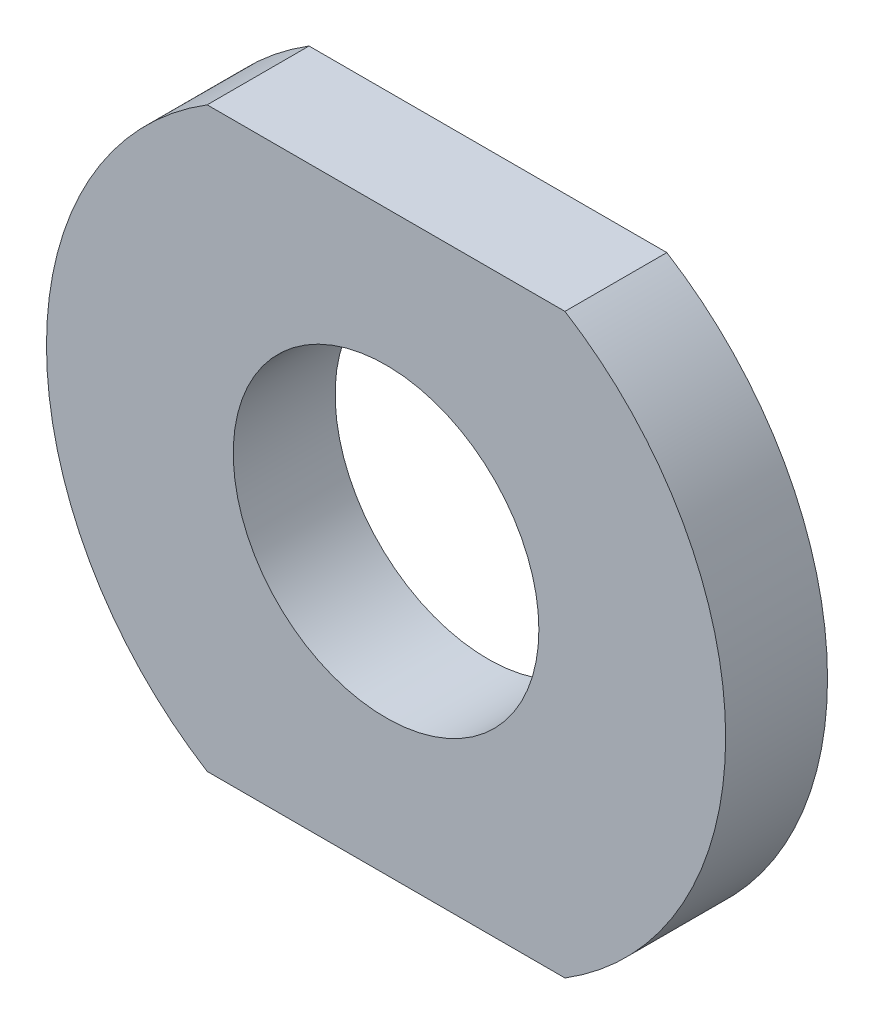
ISO-10303-21;
HEADER;
FILE_DESCRIPTION(('STEP AP214'),'2;1');
FILE_NAME('part.step','',(''),(''),'','','');
FILE_SCHEMA(('AUTOMOTIVE_DESIGN { 1 0 10303 214 1 1 1 1 }'));
ENDSEC;
DATA;
#1=APPLICATION_CONTEXT('core data for automotive mechanical design processes');
#2=APPLICATION_PROTOCOL_DEFINITION('international standard','automotive_design',2000,#1);
#3=PRODUCT_CONTEXT('',#1,'mechanical');
#4=PRODUCT('Part','Part','',(#3));
#5=PRODUCT_RELATED_PRODUCT_CATEGORY('part','',(#4));
#6=PRODUCT_DEFINITION_FORMATION('','',#4);
#7=PRODUCT_DEFINITION_CONTEXT('part definition',#1,'design');
#8=PRODUCT_DEFINITION('design','',#6,#7);
#9=PRODUCT_DEFINITION_SHAPE('','',#8);
#10=(LENGTH_UNIT() NAMED_UNIT(*) SI_UNIT(.MILLI.,.METRE.));
#11=(NAMED_UNIT(*) PLANE_ANGLE_UNIT() SI_UNIT($,.RADIAN.));
#12=(NAMED_UNIT(*) SI_UNIT($,.STERADIAN.) SOLID_ANGLE_UNIT());
#13=UNCERTAINTY_MEASURE_WITH_UNIT(LENGTH_MEASURE(1.E-05),#10,'distance_accuracy_value','');
#14=(GEOMETRIC_REPRESENTATION_CONTEXT(3) GLOBAL_UNCERTAINTY_ASSIGNED_CONTEXT((#13)) GLOBAL_UNIT_ASSIGNED_CONTEXT((#10,
#11,#12)) REPRESENTATION_CONTEXT('',''));
#15=CARTESIAN_POINT('',(0.,0.,0.));
#16=DIRECTION('',(0.,0.,1.));
#17=DIRECTION('',(1.,0.,0.));
#18=AXIS2_PLACEMENT_3D('',#15,#16,#17);
#19=CARTESIAN_POINT('',(0.,0.,3.));
#20=DIRECTION('',(0.,0.,1.));
#21=DIRECTION('',(1.,0.,0.));
#22=AXIS2_PLACEMENT_3D('',#19,#20,#21);
#23=PLANE('',#22);
#24=CARTESIAN_POINT('',(0.,0.,3.));
#25=DIRECTION('',(0.,0.,1.));
#26=DIRECTION('',(1.,0.,0.));
#27=AXIS2_PLACEMENT_3D('',#24,#25,#26);
#28=CIRCLE('',#27,10.);
#29=CARTESIAN_POINT('',(-5.26782687642637,8.5,3.));
#30=VERTEX_POINT('',#29);
#31=CARTESIAN_POINT('',(-5.26782687642637,-8.5,3.));
#32=VERTEX_POINT('',#31);
#33=EDGE_CURVE('E89',#30,#32,#28,.T.);
#34=ORIENTED_EDGE('',*,*,#33,.T.);
#35=DIRECTION('',(1.,0.,0.));
#36=VECTOR('',#35,1.);
#37=CARTESIAN_POINT('',(-5.26782687642637,-8.5,3.));
#38=LINE('',#37,#36);
#39=CARTESIAN_POINT('',(5.26782687642636,-8.5,3.));
#40=VERTEX_POINT('',#39);
#41=EDGE_CURVE('E84',#32,#40,#38,.T.);
#42=ORIENTED_EDGE('',*,*,#41,.T.);
#43=CARTESIAN_POINT('',(0.,0.,3.));
#44=DIRECTION('',(0.,0.,1.));
#45=DIRECTION('',(1.,0.,0.));
#46=AXIS2_PLACEMENT_3D('',#43,#44,#45);
#47=CIRCLE('',#46,10.);
#48=CARTESIAN_POINT('',(5.26782687642637,8.5,3.));
#49=VERTEX_POINT('',#48);
#50=EDGE_CURVE('E87',#40,#49,#47,.T.);
#51=ORIENTED_EDGE('',*,*,#50,.T.);
#52=DIRECTION('',(-1.,0.,0.));
#53=VECTOR('',#52,1.);
#54=CARTESIAN_POINT('',(-5.26782687642637,8.5,3.));
#55=LINE('',#54,#53);
#56=EDGE_CURVE('E54',#49,#30,#55,.T.);
#57=ORIENTED_EDGE('',*,*,#56,.T.);
#58=EDGE_LOOP('',(#34,#42,#51,#57));
#59=FACE_BOUND('',#58,.T.);
#60=CARTESIAN_POINT('',(0.,0.,3.));
#61=DIRECTION('',(0.,0.,1.));
#62=DIRECTION('',(1.,0.,0.));
#63=AXIS2_PLACEMENT_3D('',#60,#61,#62);
#64=CIRCLE('',#63,4.5);
#65=CARTESIAN_POINT('',(4.5,0.,3.));
#66=VERTEX_POINT('',#65);
#67=EDGE_CURVE('E104',#66,#66,#64,.T.);
#68=ORIENTED_EDGE('',*,*,#67,.F.);
#69=EDGE_LOOP('',(#68));
#70=FACE_BOUND('',#69,.T.);
#71=ADVANCED_FACE('F37',(#59,#70),#23,.T.);
#72=CARTESIAN_POINT('',(0.,0.,0.));
#73=DIRECTION('',(0.,0.,1.));
#74=DIRECTION('',(1.,0.,0.));
#75=AXIS2_PLACEMENT_3D('',#72,#73,#74);
#76=PLANE('',#75);
#77=CARTESIAN_POINT('',(0.,0.,0.));
#78=DIRECTION('',(0.,0.,1.));
#79=DIRECTION('',(1.,0.,0.));
#80=AXIS2_PLACEMENT_3D('',#77,#78,#79);
#81=CIRCLE('',#80,10.);
#82=CARTESIAN_POINT('',(-5.26782687642637,8.5,0.));
#83=VERTEX_POINT('',#82);
#84=CARTESIAN_POINT('',(-5.26782687642637,-8.5,0.));
#85=VERTEX_POINT('',#84);
#86=EDGE_CURVE('E101',#83,#85,#81,.T.);
#87=ORIENTED_EDGE('',*,*,#86,.F.);
#88=DIRECTION('',(-1.,0.,0.));
#89=VECTOR('',#88,1.);
#90=CARTESIAN_POINT('',(-5.26782687642637,8.5,0.));
#91=LINE('',#90,#89);
#92=CARTESIAN_POINT('',(5.26782687642637,8.5,0.));
#93=VERTEX_POINT('',#92);
#94=EDGE_CURVE('E77',#93,#83,#91,.T.);
#95=ORIENTED_EDGE('',*,*,#94,.F.);
#96=CARTESIAN_POINT('',(0.,0.,0.));
#97=DIRECTION('',(0.,0.,1.));
#98=DIRECTION('',(1.,0.,0.));
#99=AXIS2_PLACEMENT_3D('',#96,#97,#98);
#100=CIRCLE('',#99,10.);
#101=CARTESIAN_POINT('',(5.26782687642636,-8.5,0.));
#102=VERTEX_POINT('',#101);
#103=EDGE_CURVE('E71',#102,#93,#100,.T.);
#104=ORIENTED_EDGE('',*,*,#103,.F.);
#105=DIRECTION('',(1.,0.,0.));
#106=VECTOR('',#105,1.);
#107=CARTESIAN_POINT('',(-5.26782687642637,-8.5,0.));
#108=LINE('',#107,#106);
#109=EDGE_CURVE('E93',#85,#102,#108,.T.);
#110=ORIENTED_EDGE('',*,*,#109,.F.);
#111=EDGE_LOOP('',(#87,#95,#104,#110));
#112=FACE_BOUND('',#111,.T.);
#113=CARTESIAN_POINT('',(0.,0.,0.));
#114=DIRECTION('',(0.,0.,1.));
#115=DIRECTION('',(1.,0.,0.));
#116=AXIS2_PLACEMENT_3D('',#113,#114,#115);
#117=CIRCLE('',#116,4.5);
#118=CARTESIAN_POINT('',(4.5,0.,0.));
#119=VERTEX_POINT('',#118);
#120=EDGE_CURVE('E116',#119,#119,#117,.T.);
#121=ORIENTED_EDGE('',*,*,#120,.T.);
#122=EDGE_LOOP('',(#121));
#123=FACE_BOUND('',#122,.T.);
#124=ADVANCED_FACE('F112',(#112,#123),#76,.F.);
#125=CARTESIAN_POINT('',(0.,0.,3.));
#126=DIRECTION('',(0.,0.,-1.));
#127=DIRECTION('',(-1.,0.,0.));
#128=AXIS2_PLACEMENT_3D('',#125,#126,#127);
#129=CYLINDRICAL_SURFACE('',#128,10.);
#130=ORIENTED_EDGE('',*,*,#86,.T.);
#131=DIRECTION('',(0.,0.,-1.));
#132=VECTOR('',#131,1.);
#133=CARTESIAN_POINT('',(-5.26782687642637,-8.5,3.));
#134=LINE('',#133,#132);
#135=EDGE_CURVE('E11',#32,#85,#134,.T.);
#136=ORIENTED_EDGE('',*,*,#135,.F.);
#137=ORIENTED_EDGE('',*,*,#33,.F.);
#138=DIRECTION('',(0.,0.,-1.));
#139=VECTOR('',#138,1.);
#140=CARTESIAN_POINT('',(-5.26782687642637,8.5,3.));
#141=LINE('',#140,#139);
#142=EDGE_CURVE('E97',#30,#83,#141,.T.);
#143=ORIENTED_EDGE('',*,*,#142,.T.);
#144=EDGE_LOOP('',(#130,#136,#137,#143));
#145=FACE_BOUND('',#144,.T.);
#146=ADVANCED_FACE('F39',(#145),#129,.T.);
#147=CARTESIAN_POINT('',(-5.26782687642637,-8.5,3.));
#148=DIRECTION('',(0.,1.,0.));
#149=DIRECTION('',(0.,0.,1.));
#150=AXIS2_PLACEMENT_3D('',#147,#148,#149);
#151=PLANE('',#150);
#152=ORIENTED_EDGE('',*,*,#109,.T.);
#153=DIRECTION('',(0.,0.,-1.));
#154=VECTOR('',#153,1.);
#155=CARTESIAN_POINT('',(5.26782687642636,-8.5,3.));
#156=LINE('',#155,#154);
#157=EDGE_CURVE('E46',#40,#102,#156,.T.);
#158=ORIENTED_EDGE('',*,*,#157,.F.);
#159=ORIENTED_EDGE('',*,*,#41,.F.);
#160=ORIENTED_EDGE('',*,*,#135,.T.);
#161=EDGE_LOOP('',(#152,#158,#159,#160));
#162=FACE_BOUND('',#161,.T.);
#163=ADVANCED_FACE('F92',(#162),#151,.F.);
#164=CARTESIAN_POINT('',(0.,0.,3.));
#165=DIRECTION('',(0.,0.,-1.));
#166=DIRECTION('',(-1.,0.,0.));
#167=AXIS2_PLACEMENT_3D('',#164,#165,#166);
#168=CYLINDRICAL_SURFACE('',#167,10.);
#169=ORIENTED_EDGE('',*,*,#103,.T.);
#170=DIRECTION('',(0.,0.,-1.));
#171=VECTOR('',#170,1.);
#172=CARTESIAN_POINT('',(5.26782687642637,8.5,3.));
#173=LINE('',#172,#171);
#174=EDGE_CURVE('E94',#49,#93,#173,.T.);
#175=ORIENTED_EDGE('',*,*,#174,.F.);
#176=ORIENTED_EDGE('',*,*,#50,.F.);
#177=ORIENTED_EDGE('',*,*,#157,.T.);
#178=EDGE_LOOP('',(#169,#175,#176,#177));
#179=FACE_BOUND('',#178,.T.);
#180=ADVANCED_FACE('F95',(#179),#168,.T.);
#181=CARTESIAN_POINT('',(-5.26782687642637,8.5,3.));
#182=DIRECTION('',(0.,-1.,0.));
#183=DIRECTION('',(0.,0.,-1.));
#184=AXIS2_PLACEMENT_3D('',#181,#182,#183);
#185=PLANE('',#184);
#186=ORIENTED_EDGE('',*,*,#94,.T.);
#187=ORIENTED_EDGE('',*,*,#142,.F.);
#188=ORIENTED_EDGE('',*,*,#56,.F.);
#189=ORIENTED_EDGE('',*,*,#174,.T.);
#190=EDGE_LOOP('',(#186,#187,#188,#189));
#191=FACE_BOUND('',#190,.T.);
#192=ADVANCED_FACE('F109',(#191),#185,.F.);
#193=CARTESIAN_POINT('',(0.,0.,3.));
#194=DIRECTION('',(0.,0.,-1.));
#195=DIRECTION('',(-1.,0.,0.));
#196=AXIS2_PLACEMENT_3D('',#193,#194,#195);
#197=CYLINDRICAL_SURFACE('',#196,4.5);
#198=ORIENTED_EDGE('',*,*,#67,.T.);
#199=EDGE_LOOP('',(#198));
#200=FACE_BOUND('',#199,.T.);
#201=ORIENTED_EDGE('',*,*,#120,.F.);
#202=EDGE_LOOP('',(#201));
#203=FACE_BOUND('',#202,.T.);
#204=ADVANCED_FACE('F122',(#200,#203),#197,.F.);
#205=CLOSED_SHELL('',(#71,#124,#146,#163,#180,#192,#204));
#206=MANIFOLD_SOLID_BREP('B2',#205);
#207=ADVANCED_BREP_SHAPE_REPRESENTATION('',(#18,#206),#14);
#208=SHAPE_DEFINITION_REPRESENTATION(#9,#207);
ENDSEC;
END-ISO-10303-21;
